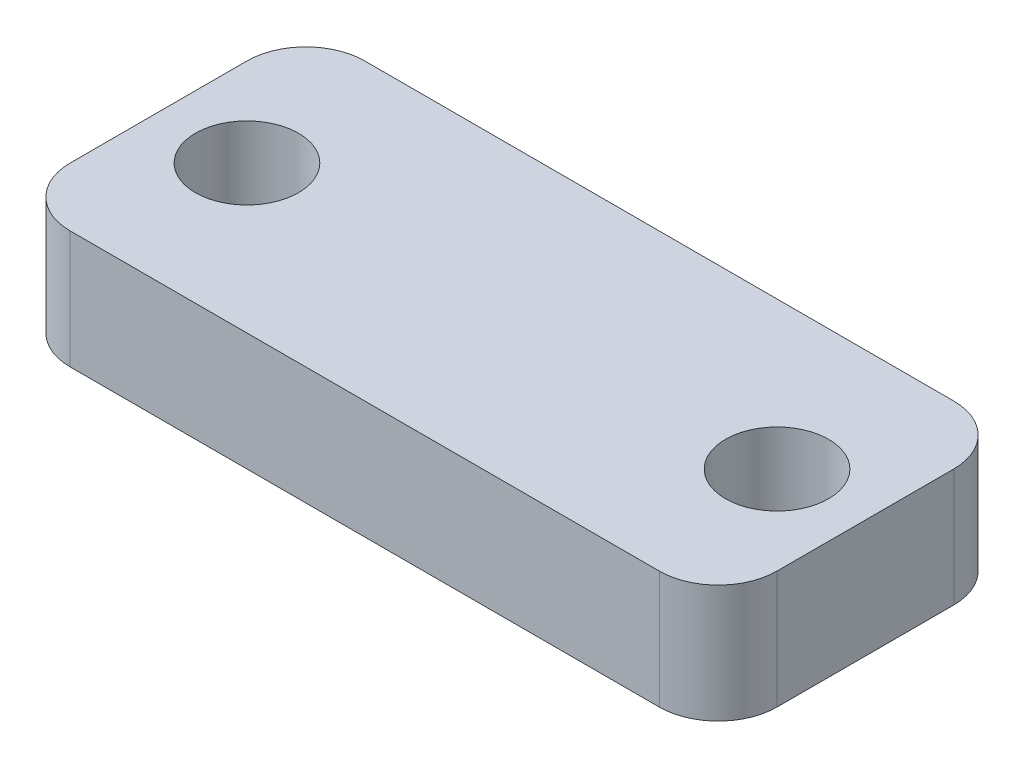
ISO-10303-21;
HEADER;
FILE_DESCRIPTION(('STEP AP214'),'2;1');
FILE_NAME('part.step','',(''),(''),'','','');
FILE_SCHEMA(('AUTOMOTIVE_DESIGN { 1 0 10303 214 1 1 1 1 }'));
ENDSEC;
DATA;
#1=APPLICATION_CONTEXT('core data for automotive mechanical design processes');
#2=APPLICATION_PROTOCOL_DEFINITION('international standard','automotive_design',2000,#1);
#3=PRODUCT_CONTEXT('',#1,'mechanical');
#4=PRODUCT('Part','Part','',(#3));
#5=PRODUCT_RELATED_PRODUCT_CATEGORY('part','',(#4));
#6=PRODUCT_DEFINITION_FORMATION('','',#4);
#7=PRODUCT_DEFINITION_CONTEXT('part definition',#1,'design');
#8=PRODUCT_DEFINITION('design','',#6,#7);
#9=PRODUCT_DEFINITION_SHAPE('','',#8);
#10=(LENGTH_UNIT() NAMED_UNIT(*) SI_UNIT(.MILLI.,.METRE.));
#11=(NAMED_UNIT(*) PLANE_ANGLE_UNIT() SI_UNIT($,.RADIAN.));
#12=(NAMED_UNIT(*) SI_UNIT($,.STERADIAN.) SOLID_ANGLE_UNIT());
#13=UNCERTAINTY_MEASURE_WITH_UNIT(LENGTH_MEASURE(1.E-05),#10,'distance_accuracy_value','');
#14=(GEOMETRIC_REPRESENTATION_CONTEXT(3) GLOBAL_UNCERTAINTY_ASSIGNED_CONTEXT((#13)) GLOBAL_UNIT_ASSIGNED_CONTEXT((#10,
#11,#12)) REPRESENTATION_CONTEXT('',''));
#15=CARTESIAN_POINT('',(0.,0.,0.));
#16=DIRECTION('',(0.,0.,1.));
#17=DIRECTION('',(1.,0.,0.));
#18=AXIS2_PLACEMENT_3D('',#15,#16,#17);
#19=CARTESIAN_POINT('',(12.,2.,-5.));
#20=DIRECTION('',(-1.,0.,0.));
#21=DIRECTION('',(0.,0.,1.));
#22=AXIS2_PLACEMENT_3D('',#19,#20,#21);
#23=PLANE('',#22);
#24=DIRECTION('',(0.,0.,-1.));
#25=VECTOR('',#24,1.);
#26=CARTESIAN_POINT('',(12.,2.,-5.));
#27=LINE('',#26,#25);
#28=CARTESIAN_POINT('',(12.,2.,3.));
#29=VERTEX_POINT('',#28);
#30=CARTESIAN_POINT('',(12.,2.,-3.));
#31=VERTEX_POINT('',#30);
#32=EDGE_CURVE('E116',#29,#31,#27,.T.);
#33=ORIENTED_EDGE('',*,*,#32,.F.);
#34=DIRECTION('',(0.,-1.,0.));
#35=VECTOR('',#34,1.);
#36=CARTESIAN_POINT('',(12.,2.,3.));
#37=LINE('',#36,#35);
#38=CARTESIAN_POINT('',(12.,-2.,3.));
#39=VERTEX_POINT('',#38);
#40=EDGE_CURVE('E101',#29,#39,#37,.T.);
#41=ORIENTED_EDGE('',*,*,#40,.T.);
#42=DIRECTION('',(0.,0.,-1.));
#43=VECTOR('',#42,1.);
#44=CARTESIAN_POINT('',(12.,-2.,-5.));
#45=LINE('',#44,#43);
#46=CARTESIAN_POINT('',(12.,-2.,-3.));
#47=VERTEX_POINT('',#46);
#48=EDGE_CURVE('E113',#39,#47,#45,.T.);
#49=ORIENTED_EDGE('',*,*,#48,.T.);
#50=DIRECTION('',(0.,-1.,0.));
#51=VECTOR('',#50,1.);
#52=CARTESIAN_POINT('',(12.,2.,-3.));
#53=LINE('',#52,#51);
#54=EDGE_CURVE('E118',#47,#31,#53,.F.);
#55=ORIENTED_EDGE('',*,*,#54,.T.);
#56=EDGE_LOOP('',(#33,#41,#49,#55));
#57=FACE_BOUND('',#56,.T.);
#58=ADVANCED_FACE('F32',(#57),#23,.F.);
#59=CARTESIAN_POINT('',(-12.,2.,-5.));
#60=DIRECTION('',(0.,0.,1.));
#61=DIRECTION('',(1.,0.,0.));
#62=AXIS2_PLACEMENT_3D('',#59,#60,#61);
#63=PLANE('',#62);
#64=DIRECTION('',(-1.,0.,0.));
#65=VECTOR('',#64,1.);
#66=CARTESIAN_POINT('',(-12.,2.,-5.));
#67=LINE('',#66,#65);
#68=CARTESIAN_POINT('',(10.,2.,-5.));
#69=VERTEX_POINT('',#68);
#70=CARTESIAN_POINT('',(-10.,2.,-5.));
#71=VERTEX_POINT('',#70);
#72=EDGE_CURVE('E171',#69,#71,#67,.T.);
#73=ORIENTED_EDGE('',*,*,#72,.F.);
#74=DIRECTION('',(0.,-1.,0.));
#75=VECTOR('',#74,1.);
#76=CARTESIAN_POINT('',(10.,2.,-5.));
#77=LINE('',#76,#75);
#78=CARTESIAN_POINT('',(10.,-2.,-5.));
#79=VERTEX_POINT('',#78);
#80=EDGE_CURVE('E155',#69,#79,#77,.T.);
#81=ORIENTED_EDGE('',*,*,#80,.T.);
#82=DIRECTION('',(-1.,0.,0.));
#83=VECTOR('',#82,1.);
#84=CARTESIAN_POINT('',(-12.,-2.,-5.));
#85=LINE('',#84,#83);
#86=CARTESIAN_POINT('',(-10.,-2.,-5.));
#87=VERTEX_POINT('',#86);
#88=EDGE_CURVE('E122',#79,#87,#85,.T.);
#89=ORIENTED_EDGE('',*,*,#88,.T.);
#90=DIRECTION('',(0.,-1.,0.));
#91=VECTOR('',#90,1.);
#92=CARTESIAN_POINT('',(-10.,2.,-5.));
#93=LINE('',#92,#91);
#94=EDGE_CURVE('E153',#87,#71,#93,.F.);
#95=ORIENTED_EDGE('',*,*,#94,.T.);
#96=EDGE_LOOP('',(#73,#81,#89,#95));
#97=FACE_BOUND('',#96,.T.);
#98=ADVANCED_FACE('F207',(#97),#63,.F.);
#99=CARTESIAN_POINT('',(-12.,2.,-5.));
#100=DIRECTION('',(1.,0.,0.));
#101=DIRECTION('',(0.,0.,-1.));
#102=AXIS2_PLACEMENT_3D('',#99,#100,#101);
#103=PLANE('',#102);
#104=DIRECTION('',(0.,0.,1.));
#105=VECTOR('',#104,1.);
#106=CARTESIAN_POINT('',(-12.,-2.,-5.));
#107=LINE('',#106,#105);
#108=CARTESIAN_POINT('',(-12.,-2.,-3.));
#109=VERTEX_POINT('',#108);
#110=CARTESIAN_POINT('',(-12.,-2.,3.));
#111=VERTEX_POINT('',#110);
#112=EDGE_CURVE('E126',#109,#111,#107,.T.);
#113=ORIENTED_EDGE('',*,*,#112,.T.);
#114=DIRECTION('',(0.,-1.,0.));
#115=VECTOR('',#114,1.);
#116=CARTESIAN_POINT('',(-12.,2.,3.));
#117=LINE('',#116,#115);
#118=CARTESIAN_POINT('',(-12.,2.,3.));
#119=VERTEX_POINT('',#118);
#120=EDGE_CURVE('E11',#111,#119,#117,.F.);
#121=ORIENTED_EDGE('',*,*,#120,.T.);
#122=DIRECTION('',(0.,0.,1.));
#123=VECTOR('',#122,1.);
#124=CARTESIAN_POINT('',(-12.,2.,-5.));
#125=LINE('',#124,#123);
#126=CARTESIAN_POINT('',(-12.,2.,-3.));
#127=VERTEX_POINT('',#126);
#128=EDGE_CURVE('E161',#127,#119,#125,.T.);
#129=ORIENTED_EDGE('',*,*,#128,.F.);
#130=DIRECTION('',(0.,-1.,0.));
#131=VECTOR('',#130,1.);
#132=CARTESIAN_POINT('',(-12.,2.,-3.));
#133=LINE('',#132,#131);
#134=EDGE_CURVE('E40',#127,#109,#133,.T.);
#135=ORIENTED_EDGE('',*,*,#134,.T.);
#136=EDGE_LOOP('',(#113,#121,#129,#135));
#137=FACE_BOUND('',#136,.T.);
#138=ADVANCED_FACE('F160',(#137),#103,.F.);
#139=CARTESIAN_POINT('',(-12.,2.,5.));
#140=DIRECTION('',(0.,0.,-1.));
#141=DIRECTION('',(-1.,0.,0.));
#142=AXIS2_PLACEMENT_3D('',#139,#140,#141);
#143=PLANE('',#142);
#144=DIRECTION('',(1.,0.,0.));
#145=VECTOR('',#144,1.);
#146=CARTESIAN_POINT('',(-12.,-2.,5.));
#147=LINE('',#146,#145);
#148=CARTESIAN_POINT('',(-10.,-2.,5.));
#149=VERTEX_POINT('',#148);
#150=CARTESIAN_POINT('',(10.,-2.,5.));
#151=VERTEX_POINT('',#150);
#152=EDGE_CURVE('E136',#149,#151,#147,.T.);
#153=ORIENTED_EDGE('',*,*,#152,.T.);
#154=DIRECTION('',(0.,-1.,0.));
#155=VECTOR('',#154,1.);
#156=CARTESIAN_POINT('',(10.,2.,5.));
#157=LINE('',#156,#155);
#158=CARTESIAN_POINT('',(10.,2.,5.));
#159=VERTEX_POINT('',#158);
#160=EDGE_CURVE('E102',#151,#159,#157,.F.);
#161=ORIENTED_EDGE('',*,*,#160,.T.);
#162=DIRECTION('',(1.,0.,0.));
#163=VECTOR('',#162,1.);
#164=CARTESIAN_POINT('',(-12.,2.,5.));
#165=LINE('',#164,#163);
#166=CARTESIAN_POINT('',(-10.,2.,5.));
#167=VERTEX_POINT('',#166);
#168=EDGE_CURVE('E132',#167,#159,#165,.T.);
#169=ORIENTED_EDGE('',*,*,#168,.F.);
#170=DIRECTION('',(0.,-1.,0.));
#171=VECTOR('',#170,1.);
#172=CARTESIAN_POINT('',(-10.,2.,5.));
#173=LINE('',#172,#171);
#174=EDGE_CURVE('E107',#167,#149,#173,.T.);
#175=ORIENTED_EDGE('',*,*,#174,.T.);
#176=EDGE_LOOP('',(#153,#161,#169,#175));
#177=FACE_BOUND('',#176,.T.);
#178=ADVANCED_FACE('F169',(#177),#143,.F.);
#179=CARTESIAN_POINT('',(0.,2.,0.));
#180=DIRECTION('',(0.,1.,0.));
#181=DIRECTION('',(0.,0.,1.));
#182=AXIS2_PLACEMENT_3D('',#179,#180,#181);
#183=PLANE('',#182);
#184=CARTESIAN_POINT('',(9.,2.,0.));
#185=DIRECTION('',(0.,-1.,0.));
#186=DIRECTION('',(0.,0.,1.));
#187=AXIS2_PLACEMENT_3D('',#184,#185,#186);
#188=CIRCLE('',#187,1.75);
#189=CARTESIAN_POINT('',(9.,2.,1.75));
#190=VERTEX_POINT('',#189);
#191=EDGE_CURVE('E178',#190,#190,#188,.T.);
#192=ORIENTED_EDGE('',*,*,#191,.T.);
#193=EDGE_LOOP('',(#192));
#194=FACE_BOUND('',#193,.T.);
#195=CARTESIAN_POINT('',(-9.,2.,0.));
#196=DIRECTION('',(0.,1.,0.));
#197=DIRECTION('',(0.,0.,1.));
#198=AXIS2_PLACEMENT_3D('',#195,#196,#197);
#199=CIRCLE('',#198,1.75);
#200=CARTESIAN_POINT('',(-9.,2.,1.75));
#201=VERTEX_POINT('',#200);
#202=EDGE_CURVE('E129',#201,#201,#199,.T.);
#203=ORIENTED_EDGE('',*,*,#202,.F.);
#204=EDGE_LOOP('',(#203));
#205=FACE_BOUND('',#204,.T.);
#206=ORIENTED_EDGE('',*,*,#168,.T.);
#207=CARTESIAN_POINT('',(10.,2.,3.));
#208=DIRECTION('',(0.,1.,0.));
#209=DIRECTION('',(0.,0.,1.));
#210=AXIS2_PLACEMENT_3D('',#207,#208,#209);
#211=CIRCLE('',#210,2.);
#212=EDGE_CURVE('E151',#159,#29,#211,.T.);
#213=ORIENTED_EDGE('',*,*,#212,.T.);
#214=ORIENTED_EDGE('',*,*,#32,.T.);
#215=CARTESIAN_POINT('',(10.,2.,-3.));
#216=DIRECTION('',(0.,1.,0.));
#217=DIRECTION('',(0.,0.,1.));
#218=AXIS2_PLACEMENT_3D('',#215,#216,#217);
#219=CIRCLE('',#218,2.);
#220=EDGE_CURVE('E149',#31,#69,#219,.T.);
#221=ORIENTED_EDGE('',*,*,#220,.T.);
#222=ORIENTED_EDGE('',*,*,#72,.T.);
#223=CARTESIAN_POINT('',(-10.,2.,-3.));
#224=DIRECTION('',(0.,1.,0.));
#225=DIRECTION('',(0.,0.,1.));
#226=AXIS2_PLACEMENT_3D('',#223,#224,#225);
#227=CIRCLE('',#226,2.);
#228=EDGE_CURVE('E52',#71,#127,#227,.T.);
#229=ORIENTED_EDGE('',*,*,#228,.T.);
#230=ORIENTED_EDGE('',*,*,#128,.T.);
#231=CARTESIAN_POINT('',(-10.,2.,3.));
#232=DIRECTION('',(0.,1.,0.));
#233=DIRECTION('',(0.,0.,1.));
#234=AXIS2_PLACEMENT_3D('',#231,#232,#233);
#235=CIRCLE('',#234,2.);
#236=EDGE_CURVE('E147',#119,#167,#235,.T.);
#237=ORIENTED_EDGE('',*,*,#236,.T.);
#238=EDGE_LOOP('',(#206,#213,#214,#221,#222,#229,#230,#237));
#239=FACE_BOUND('',#238,.T.);
#240=ADVANCED_FACE('F190',(#194,#205,#239),#183,.T.);
#241=CARTESIAN_POINT('',(0.,-2.,0.));
#242=DIRECTION('',(0.,1.,0.));
#243=DIRECTION('',(0.,0.,1.));
#244=AXIS2_PLACEMENT_3D('',#241,#242,#243);
#245=PLANE('',#244);
#246=CARTESIAN_POINT('',(9.,-2.,0.));
#247=DIRECTION('',(0.,-1.,0.));
#248=DIRECTION('',(0.,0.,1.));
#249=AXIS2_PLACEMENT_3D('',#246,#247,#248);
#250=CIRCLE('',#249,1.75);
#251=CARTESIAN_POINT('',(9.,-2.,1.75));
#252=VERTEX_POINT('',#251);
#253=EDGE_CURVE('E176',#252,#252,#250,.T.);
#254=ORIENTED_EDGE('',*,*,#253,.F.);
#255=EDGE_LOOP('',(#254));
#256=FACE_BOUND('',#255,.T.);
#257=CARTESIAN_POINT('',(-9.,-2.,0.));
#258=DIRECTION('',(0.,1.,0.));
#259=DIRECTION('',(0.,0.,1.));
#260=AXIS2_PLACEMENT_3D('',#257,#258,#259);
#261=CIRCLE('',#260,1.75);
#262=CARTESIAN_POINT('',(-9.,-2.,1.75));
#263=VERTEX_POINT('',#262);
#264=EDGE_CURVE('E123',#263,#263,#261,.T.);
#265=ORIENTED_EDGE('',*,*,#264,.T.);
#266=EDGE_LOOP('',(#265));
#267=FACE_BOUND('',#266,.T.);
#268=ORIENTED_EDGE('',*,*,#48,.F.);
#269=CARTESIAN_POINT('',(10.,-2.,3.));
#270=DIRECTION('',(0.,1.,0.));
#271=DIRECTION('',(0.,0.,1.));
#272=AXIS2_PLACEMENT_3D('',#269,#270,#271);
#273=CIRCLE('',#272,2.);
#274=EDGE_CURVE('E97',#39,#151,#273,.F.);
#275=ORIENTED_EDGE('',*,*,#274,.T.);
#276=ORIENTED_EDGE('',*,*,#152,.F.);
#277=CARTESIAN_POINT('',(-10.,-2.,3.));
#278=DIRECTION('',(0.,1.,0.));
#279=DIRECTION('',(0.,0.,1.));
#280=AXIS2_PLACEMENT_3D('',#277,#278,#279);
#281=CIRCLE('',#280,2.);
#282=EDGE_CURVE('E140',#149,#111,#281,.F.);
#283=ORIENTED_EDGE('',*,*,#282,.T.);
#284=ORIENTED_EDGE('',*,*,#112,.F.);
#285=CARTESIAN_POINT('',(-10.,-2.,-3.));
#286=DIRECTION('',(0.,1.,0.));
#287=DIRECTION('',(0.,0.,1.));
#288=AXIS2_PLACEMENT_3D('',#285,#286,#287);
#289=CIRCLE('',#288,2.);
#290=EDGE_CURVE('E117',#109,#87,#289,.F.);
#291=ORIENTED_EDGE('',*,*,#290,.T.);
#292=ORIENTED_EDGE('',*,*,#88,.F.);
#293=CARTESIAN_POINT('',(10.,-2.,-3.));
#294=DIRECTION('',(0.,1.,0.));
#295=DIRECTION('',(0.,0.,1.));
#296=AXIS2_PLACEMENT_3D('',#293,#294,#295);
#297=CIRCLE('',#296,2.);
#298=EDGE_CURVE('E108',#79,#47,#297,.F.);
#299=ORIENTED_EDGE('',*,*,#298,.T.);
#300=EDGE_LOOP('',(#268,#275,#276,#283,#284,#291,#292,#299));
#301=FACE_BOUND('',#300,.T.);
#302=ADVANCED_FACE('F120',(#256,#267,#301),#245,.F.);
#303=CARTESIAN_POINT('',(-9.,-2.,0.));
#304=DIRECTION('',(0.,1.,0.));
#305=DIRECTION('',(0.,0.,1.));
#306=AXIS2_PLACEMENT_3D('',#303,#304,#305);
#307=CYLINDRICAL_SURFACE('',#306,1.75);
#308=ORIENTED_EDGE('',*,*,#264,.F.);
#309=EDGE_LOOP('',(#308));
#310=FACE_BOUND('',#309,.T.);
#311=ORIENTED_EDGE('',*,*,#202,.T.);
#312=EDGE_LOOP('',(#311));
#313=FACE_BOUND('',#312,.T.);
#314=ADVANCED_FACE('F189',(#310,#313),#307,.F.);
#315=CARTESIAN_POINT('',(9.,-2.,0.));
#316=DIRECTION('',(0.,1.,0.));
#317=DIRECTION('',(0.,0.,1.));
#318=AXIS2_PLACEMENT_3D('',#315,#316,#317);
#319=CYLINDRICAL_SURFACE('',#318,1.75);
#320=ORIENTED_EDGE('',*,*,#253,.T.);
#321=EDGE_LOOP('',(#320));
#322=FACE_BOUND('',#321,.T.);
#323=ORIENTED_EDGE('',*,*,#191,.F.);
#324=EDGE_LOOP('',(#323));
#325=FACE_BOUND('',#324,.T.);
#326=ADVANCED_FACE('F184',(#322,#325),#319,.F.);
#327=CARTESIAN_POINT('',(10.,2.,3.));
#328=DIRECTION('',(0.,-1.,0.));
#329=DIRECTION('',(0.,0.,-1.));
#330=AXIS2_PLACEMENT_3D('',#327,#328,#329);
#331=CYLINDRICAL_SURFACE('',#330,2.);
#332=ORIENTED_EDGE('',*,*,#212,.F.);
#333=ORIENTED_EDGE('',*,*,#160,.F.);
#334=ORIENTED_EDGE('',*,*,#274,.F.);
#335=ORIENTED_EDGE('',*,*,#40,.F.);
#336=EDGE_LOOP('',(#332,#333,#334,#335));
#337=FACE_BOUND('',#336,.T.);
#338=ADVANCED_FACE('F100',(#337),#331,.T.);
#339=CARTESIAN_POINT('',(10.,2.,-3.));
#340=DIRECTION('',(0.,-1.,0.));
#341=DIRECTION('',(0.,0.,-1.));
#342=AXIS2_PLACEMENT_3D('',#339,#340,#341);
#343=CYLINDRICAL_SURFACE('',#342,2.);
#344=ORIENTED_EDGE('',*,*,#220,.F.);
#345=ORIENTED_EDGE('',*,*,#54,.F.);
#346=ORIENTED_EDGE('',*,*,#298,.F.);
#347=ORIENTED_EDGE('',*,*,#80,.F.);
#348=EDGE_LOOP('',(#344,#345,#346,#347));
#349=FACE_BOUND('',#348,.T.);
#350=ADVANCED_FACE('F218',(#349),#343,.T.);
#351=CARTESIAN_POINT('',(-10.,2.,3.));
#352=DIRECTION('',(0.,-1.,0.));
#353=DIRECTION('',(0.,0.,-1.));
#354=AXIS2_PLACEMENT_3D('',#351,#352,#353);
#355=CYLINDRICAL_SURFACE('',#354,2.);
#356=ORIENTED_EDGE('',*,*,#236,.F.);
#357=ORIENTED_EDGE('',*,*,#120,.F.);
#358=ORIENTED_EDGE('',*,*,#282,.F.);
#359=ORIENTED_EDGE('',*,*,#174,.F.);
#360=EDGE_LOOP('',(#356,#357,#358,#359));
#361=FACE_BOUND('',#360,.T.);
#362=ADVANCED_FACE('F166',(#361),#355,.T.);
#363=CARTESIAN_POINT('',(-10.,2.,-3.));
#364=DIRECTION('',(0.,-1.,0.));
#365=DIRECTION('',(0.,0.,-1.));
#366=AXIS2_PLACEMENT_3D('',#363,#364,#365);
#367=CYLINDRICAL_SURFACE('',#366,2.);
#368=ORIENTED_EDGE('',*,*,#228,.F.);
#369=ORIENTED_EDGE('',*,*,#94,.F.);
#370=ORIENTED_EDGE('',*,*,#290,.F.);
#371=ORIENTED_EDGE('',*,*,#134,.F.);
#372=EDGE_LOOP('',(#368,#369,#370,#371));
#373=FACE_BOUND('',#372,.T.);
#374=ADVANCED_FACE('F34',(#373),#367,.T.);
#375=CLOSED_SHELL('',(#58,#98,#138,#178,#240,#302,#314,#326,#338,#350,#362,#374));
#376=MANIFOLD_SOLID_BREP('B2',#375);
#377=ADVANCED_BREP_SHAPE_REPRESENTATION('',(#18,#376),#14);
#378=SHAPE_DEFINITION_REPRESENTATION(#9,#377);
ENDSEC;
END-ISO-10303-21;
